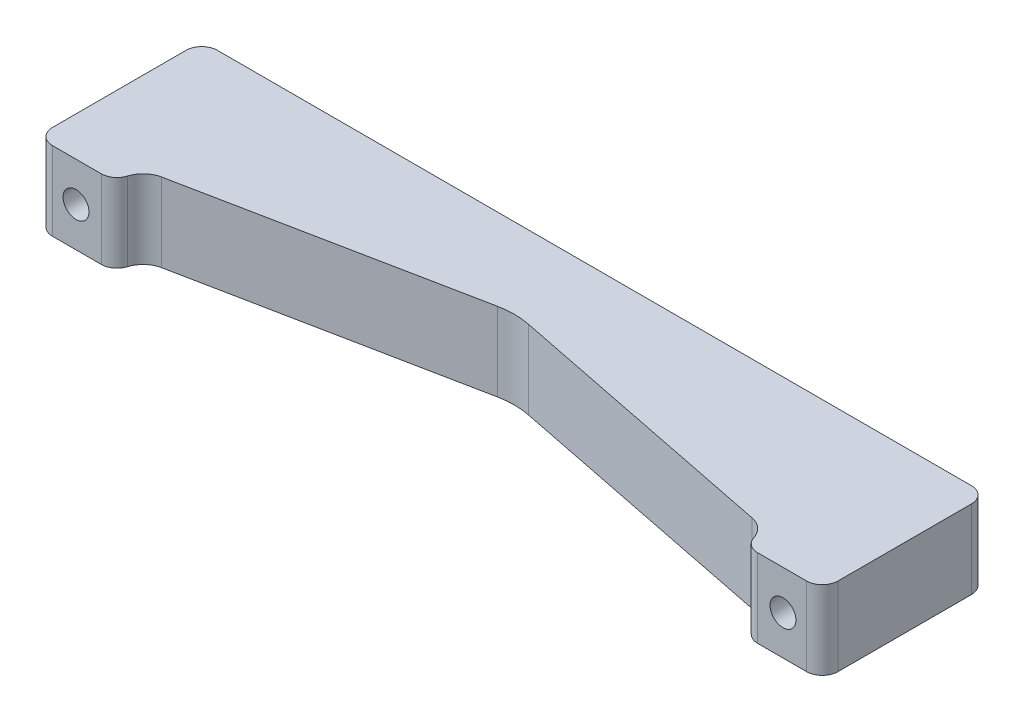
ISO-10303-21;
HEADER;
FILE_DESCRIPTION(('STEP AP214'),'2;1');
FILE_NAME('part.step','',(''),(''),'','','');
FILE_SCHEMA(('AUTOMOTIVE_DESIGN { 1 0 10303 214 1 1 1 1 }'));
ENDSEC;
DATA;
#1=APPLICATION_CONTEXT('core data for automotive mechanical design processes');
#2=APPLICATION_PROTOCOL_DEFINITION('international standard','automotive_design',2000,#1);
#3=PRODUCT_CONTEXT('',#1,'mechanical');
#4=PRODUCT('Part','Part','',(#3));
#5=PRODUCT_RELATED_PRODUCT_CATEGORY('part','',(#4));
#6=PRODUCT_DEFINITION_FORMATION('','',#4);
#7=PRODUCT_DEFINITION_CONTEXT('part definition',#1,'design');
#8=PRODUCT_DEFINITION('design','',#6,#7);
#9=PRODUCT_DEFINITION_SHAPE('','',#8);
#10=(LENGTH_UNIT() NAMED_UNIT(*) SI_UNIT(.MILLI.,.METRE.));
#11=(NAMED_UNIT(*) PLANE_ANGLE_UNIT() SI_UNIT($,.RADIAN.));
#12=(NAMED_UNIT(*) SI_UNIT($,.STERADIAN.) SOLID_ANGLE_UNIT());
#13=UNCERTAINTY_MEASURE_WITH_UNIT(LENGTH_MEASURE(1.E-05),#10,'distance_accuracy_value','');
#14=(GEOMETRIC_REPRESENTATION_CONTEXT(3) GLOBAL_UNCERTAINTY_ASSIGNED_CONTEXT((#13)) GLOBAL_UNIT_ASSIGNED_CONTEXT((#10,
#11,#12)) REPRESENTATION_CONTEXT('',''));
#15=CARTESIAN_POINT('',(0.,0.,0.));
#16=DIRECTION('',(0.,0.,1.));
#17=DIRECTION('',(1.,0.,0.));
#18=AXIS2_PLACEMENT_3D('',#15,#16,#17);
#19=CARTESIAN_POINT('',(0.,10.,-11.));
#20=DIRECTION('',(0.196116135138184,0.,-0.98058067569092));
#21=DIRECTION('',(-0.98058067569092,0.,-0.196116135138184));
#22=AXIS2_PLACEMENT_3D('',#19,#20,#21);
#23=PLANE('',#22);
#24=DIRECTION('',(0.98058067569092,0.,0.196116135138184));
#25=VECTOR('',#24,1.);
#26=CARTESIAN_POINT('',(0.,10.,-11.));
#27=LINE('',#26,#25);
#28=CARTESIAN_POINT('',(1.96116135138184,10.,-10.6077677297236));
#29=VERTEX_POINT('',#28);
#30=CARTESIAN_POINT('',(37.5883484054145,10.,-3.48233031891711));
#31=VERTEX_POINT('',#30);
#32=EDGE_CURVE('E267',#29,#31,#27,.T.);
#33=ORIENTED_EDGE('',*,*,#32,.F.);
#34=DIRECTION('',(0.,-1.,0.));
#35=VECTOR('',#34,1.);
#36=CARTESIAN_POINT('',(1.96116135138184,0.,-10.6077677297236));
#37=LINE('',#36,#35);
#38=CARTESIAN_POINT('',(1.96116135138184,0.,-10.6077677297236));
#39=VERTEX_POINT('',#38);
#40=EDGE_CURVE('E182',#29,#39,#37,.T.);
#41=ORIENTED_EDGE('',*,*,#40,.T.);
#42=DIRECTION('',(0.98058067569092,0.,0.196116135138184));
#43=VECTOR('',#42,1.);
#44=CARTESIAN_POINT('',(0.,0.,-11.));
#45=LINE('',#44,#43);
#46=CARTESIAN_POINT('',(37.5883484054145,0.,-3.48233031891711));
#47=VERTEX_POINT('',#46);
#48=EDGE_CURVE('E167',#39,#47,#45,.T.);
#49=ORIENTED_EDGE('',*,*,#48,.T.);
#50=DIRECTION('',(0.,-1.,0.));
#51=VECTOR('',#50,1.);
#52=CARTESIAN_POINT('',(37.5883484054145,10.,-3.48233031891711));
#53=LINE('',#52,#51);
#54=EDGE_CURVE('E179',#47,#31,#53,.F.);
#55=ORIENTED_EDGE('',*,*,#54,.T.);
#56=EDGE_LOOP('',(#33,#41,#49,#55));
#57=FACE_BOUND('',#56,.T.);
#58=ADVANCED_FACE('F48',(#57),#23,.F.);
#59=CARTESIAN_POINT('',(40.,10.,0.));
#60=DIRECTION('',(0.,0.,-1.));
#61=DIRECTION('',(-1.,0.,0.));
#62=AXIS2_PLACEMENT_3D('',#59,#60,#61);
#63=PLANE('',#62);
#64=CARTESIAN_POINT('',(45.,5.,0.));
#65=DIRECTION('',(0.,0.,1.));
#66=DIRECTION('',(1.,0.,0.));
#67=AXIS2_PLACEMENT_3D('',#64,#65,#66);
#68=CIRCLE('',#67,1.64999999999999);
#69=CARTESIAN_POINT('',(46.65,5.,0.));
#70=VERTEX_POINT('',#69);
#71=EDGE_CURVE('E294',#70,#70,#68,.T.);
#72=ORIENTED_EDGE('',*,*,#71,.F.);
#73=EDGE_LOOP('',(#72));
#74=FACE_BOUND('',#73,.T.);
#75=DIRECTION('',(1.,0.,0.));
#76=VECTOR('',#75,1.);
#77=CARTESIAN_POINT('',(40.,10.,0.));
#78=LINE('',#77,#76);
#79=CARTESIAN_POINT('',(41.7822711619165,10.,0.));
#80=VERTEX_POINT('',#79);
#81=CARTESIAN_POINT('',(48.,10.,0.));
#82=VERTEX_POINT('',#81);
#83=EDGE_CURVE('E288',#80,#82,#78,.T.);
#84=ORIENTED_EDGE('',*,*,#83,.F.);
#85=DIRECTION('',(0.,1.,0.));
#86=VECTOR('',#85,1.);
#87=CARTESIAN_POINT('',(41.7822711619165,10.,0.));
#88=LINE('',#87,#86);
#89=CARTESIAN_POINT('',(41.7822711619165,0.,0.));
#90=VERTEX_POINT('',#89);
#91=EDGE_CURVE('E214',#80,#90,#88,.F.);
#92=ORIENTED_EDGE('',*,*,#91,.T.);
#93=DIRECTION('',(1.,0.,0.));
#94=VECTOR('',#93,1.);
#95=CARTESIAN_POINT('',(40.,0.,0.));
#96=LINE('',#95,#94);
#97=CARTESIAN_POINT('',(48.,0.,0.));
#98=VERTEX_POINT('',#97);
#99=EDGE_CURVE('E183',#90,#98,#96,.T.);
#100=ORIENTED_EDGE('',*,*,#99,.T.);
#101=DIRECTION('',(0.,-1.,0.));
#102=VECTOR('',#101,1.);
#103=CARTESIAN_POINT('',(48.,10.,0.));
#104=LINE('',#103,#102);
#105=EDGE_CURVE('E212',#98,#82,#104,.F.);
#106=ORIENTED_EDGE('',*,*,#105,.T.);
#107=EDGE_LOOP('',(#84,#92,#100,#106));
#108=FACE_BOUND('',#107,.T.);
#109=ADVANCED_FACE('F322',(#74,#108),#63,.F.);
#110=CARTESIAN_POINT('',(50.,10.,0.));
#111=DIRECTION('',(-1.,0.,0.));
#112=DIRECTION('',(0.,0.,1.));
#113=AXIS2_PLACEMENT_3D('',#110,#111,#112);
#114=PLANE('',#113);
#115=DIRECTION('',(0.,0.,-1.));
#116=VECTOR('',#115,1.);
#117=CARTESIAN_POINT('',(50.,10.,0.));
#118=LINE('',#117,#116);
#119=CARTESIAN_POINT('',(50.,10.,-1.99999999999993));
#120=VERTEX_POINT('',#119);
#121=CARTESIAN_POINT('',(50.,10.,-19.));
#122=VERTEX_POINT('',#121);
#123=EDGE_CURVE('E285',#120,#122,#118,.T.);
#124=ORIENTED_EDGE('',*,*,#123,.F.);
#125=DIRECTION('',(0.,-1.,0.));
#126=VECTOR('',#125,1.);
#127=CARTESIAN_POINT('',(50.,10.,-1.99999999999993));
#128=LINE('',#127,#126);
#129=CARTESIAN_POINT('',(50.,0.,-1.99999999999993));
#130=VERTEX_POINT('',#129);
#131=EDGE_CURVE('E243',#120,#130,#128,.T.);
#132=ORIENTED_EDGE('',*,*,#131,.T.);
#133=DIRECTION('',(0.,0.,-1.));
#134=VECTOR('',#133,1.);
#135=CARTESIAN_POINT('',(50.,0.,0.));
#136=LINE('',#135,#134);
#137=CARTESIAN_POINT('',(50.,0.,-19.));
#138=VERTEX_POINT('',#137);
#139=EDGE_CURVE('E273',#130,#138,#136,.T.);
#140=ORIENTED_EDGE('',*,*,#139,.T.);
#141=DIRECTION('',(0.,-1.,0.));
#142=VECTOR('',#141,1.);
#143=CARTESIAN_POINT('',(50.,10.,-19.));
#144=LINE('',#143,#142);
#145=EDGE_CURVE('E241',#138,#122,#144,.F.);
#146=ORIENTED_EDGE('',*,*,#145,.T.);
#147=EDGE_LOOP('',(#124,#132,#140,#146));
#148=FACE_BOUND('',#147,.T.);
#149=ADVANCED_FACE('F328',(#148),#114,.F.);
#150=CARTESIAN_POINT('',(50.,10.,-21.));
#151=DIRECTION('',(0.,0.,1.));
#152=DIRECTION('',(1.,0.,0.));
#153=AXIS2_PLACEMENT_3D('',#150,#151,#152);
#154=PLANE('',#153);
#155=CARTESIAN_POINT('',(-45.,5.,-21.));
#156=DIRECTION('',(0.,0.,1.));
#157=DIRECTION('',(1.,0.,0.));
#158=AXIS2_PLACEMENT_3D('',#155,#156,#157);
#159=CIRCLE('',#158,1.65);
#160=CARTESIAN_POINT('',(-43.35,5.,-21.));
#161=VERTEX_POINT('',#160);
#162=EDGE_CURVE('E297',#161,#161,#159,.T.);
#163=ORIENTED_EDGE('',*,*,#162,.T.);
#164=EDGE_LOOP('',(#163));
#165=FACE_BOUND('',#164,.T.);
#166=CARTESIAN_POINT('',(45.,5.,-21.));
#167=DIRECTION('',(0.,0.,1.));
#168=DIRECTION('',(1.,0.,0.));
#169=AXIS2_PLACEMENT_3D('',#166,#167,#168);
#170=CIRCLE('',#169,1.65);
#171=CARTESIAN_POINT('',(46.65,5.,-21.));
#172=VERTEX_POINT('',#171);
#173=EDGE_CURVE('E184',#172,#172,#170,.T.);
#174=ORIENTED_EDGE('',*,*,#173,.T.);
#175=EDGE_LOOP('',(#174));
#176=FACE_BOUND('',#175,.T.);
#177=DIRECTION('',(-1.,0.,0.));
#178=VECTOR('',#177,1.);
#179=CARTESIAN_POINT('',(50.,10.,-21.));
#180=LINE('',#179,#178);
#181=CARTESIAN_POINT('',(48.,10.,-21.));
#182=VERTEX_POINT('',#181);
#183=CARTESIAN_POINT('',(-48.,10.,-21.));
#184=VERTEX_POINT('',#183);
#185=EDGE_CURVE('E282',#182,#184,#180,.T.);
#186=ORIENTED_EDGE('',*,*,#185,.F.);
#187=DIRECTION('',(0.,-1.,0.));
#188=VECTOR('',#187,1.);
#189=CARTESIAN_POINT('',(48.,10.,-21.));
#190=LINE('',#189,#188);
#191=CARTESIAN_POINT('',(48.,0.,-21.));
#192=VERTEX_POINT('',#191);
#193=EDGE_CURVE('E248',#182,#192,#190,.T.);
#194=ORIENTED_EDGE('',*,*,#193,.T.);
#195=DIRECTION('',(-1.,0.,0.));
#196=VECTOR('',#195,1.);
#197=CARTESIAN_POINT('',(50.,0.,-21.));
#198=LINE('',#197,#196);
#199=CARTESIAN_POINT('',(-48.,0.,-21.));
#200=VERTEX_POINT('',#199);
#201=EDGE_CURVE('E268',#192,#200,#198,.T.);
#202=ORIENTED_EDGE('',*,*,#201,.T.);
#203=DIRECTION('',(0.,-1.,0.));
#204=VECTOR('',#203,1.);
#205=CARTESIAN_POINT('',(-48.,10.,-21.));
#206=LINE('',#205,#204);
#207=EDGE_CURVE('E246',#200,#184,#206,.F.);
#208=ORIENTED_EDGE('',*,*,#207,.T.);
#209=EDGE_LOOP('',(#186,#194,#202,#208));
#210=FACE_BOUND('',#209,.T.);
#211=ADVANCED_FACE('F318',(#165,#176,#210),#154,.F.);
#212=CARTESIAN_POINT('',(-50.,10.,0.));
#213=DIRECTION('',(1.,0.,0.));
#214=DIRECTION('',(0.,0.,-1.));
#215=AXIS2_PLACEMENT_3D('',#212,#213,#214);
#216=PLANE('',#215);
#217=DIRECTION('',(0.,0.,1.));
#218=VECTOR('',#217,1.);
#219=CARTESIAN_POINT('',(-50.,10.,0.));
#220=LINE('',#219,#218);
#221=CARTESIAN_POINT('',(-50.,10.,-19.));
#222=VERTEX_POINT('',#221);
#223=CARTESIAN_POINT('',(-50.,10.,-2.));
#224=VERTEX_POINT('',#223);
#225=EDGE_CURVE('E279',#222,#224,#220,.T.);
#226=ORIENTED_EDGE('',*,*,#225,.F.);
#227=DIRECTION('',(0.,-1.,0.));
#228=VECTOR('',#227,1.);
#229=CARTESIAN_POINT('',(-50.,10.,-19.));
#230=LINE('',#229,#228);
#231=CARTESIAN_POINT('',(-50.,0.,-19.));
#232=VERTEX_POINT('',#231);
#233=EDGE_CURVE('E253',#222,#232,#230,.T.);
#234=ORIENTED_EDGE('',*,*,#233,.T.);
#235=DIRECTION('',(0.,0.,1.));
#236=VECTOR('',#235,1.);
#237=CARTESIAN_POINT('',(-50.,0.,0.));
#238=LINE('',#237,#236);
#239=CARTESIAN_POINT('',(-50.,0.,-2.));
#240=VERTEX_POINT('',#239);
#241=EDGE_CURVE('E265',#232,#240,#238,.T.);
#242=ORIENTED_EDGE('',*,*,#241,.T.);
#243=DIRECTION('',(0.,-1.,0.));
#244=VECTOR('',#243,1.);
#245=CARTESIAN_POINT('',(-50.,10.,-2.));
#246=LINE('',#245,#244);
#247=EDGE_CURVE('E251',#240,#224,#246,.F.);
#248=ORIENTED_EDGE('',*,*,#247,.T.);
#249=EDGE_LOOP('',(#226,#234,#242,#248));
#250=FACE_BOUND('',#249,.T.);
#251=ADVANCED_FACE('F308',(#250),#216,.F.);
#252=CARTESIAN_POINT('',(-40.,10.,0.));
#253=DIRECTION('',(0.,0.,-1.));
#254=DIRECTION('',(-1.,0.,0.));
#255=AXIS2_PLACEMENT_3D('',#252,#253,#254);
#256=PLANE('',#255);
#257=CARTESIAN_POINT('',(-45.,5.,0.));
#258=DIRECTION('',(0.,0.,1.));
#259=DIRECTION('',(1.,0.,0.));
#260=AXIS2_PLACEMENT_3D('',#257,#258,#259);
#261=CIRCLE('',#260,1.64999999999998);
#262=CARTESIAN_POINT('',(-43.35,5.,0.));
#263=VERTEX_POINT('',#262);
#264=EDGE_CURVE('E300',#263,#263,#261,.T.);
#265=ORIENTED_EDGE('',*,*,#264,.F.);
#266=EDGE_LOOP('',(#265));
#267=FACE_BOUND('',#266,.T.);
#268=DIRECTION('',(1.,0.,0.));
#269=VECTOR('',#268,1.);
#270=CARTESIAN_POINT('',(-40.,10.,0.));
#271=LINE('',#270,#269);
#272=CARTESIAN_POINT('',(-48.,10.,0.));
#273=VERTEX_POINT('',#272);
#274=CARTESIAN_POINT('',(-41.7822711619165,10.,0.));
#275=VERTEX_POINT('',#274);
#276=EDGE_CURVE('E193',#273,#275,#271,.T.);
#277=ORIENTED_EDGE('',*,*,#276,.F.);
#278=DIRECTION('',(0.,-1.,0.));
#279=VECTOR('',#278,1.);
#280=CARTESIAN_POINT('',(-48.,10.,0.));
#281=LINE('',#280,#279);
#282=CARTESIAN_POINT('',(-48.,0.,0.));
#283=VERTEX_POINT('',#282);
#284=EDGE_CURVE('E56',#273,#283,#281,.T.);
#285=ORIENTED_EDGE('',*,*,#284,.T.);
#286=DIRECTION('',(1.,0.,0.));
#287=VECTOR('',#286,1.);
#288=CARTESIAN_POINT('',(-40.,0.,0.));
#289=LINE('',#288,#287);
#290=CARTESIAN_POINT('',(-41.7822711619165,0.,0.));
#291=VERTEX_POINT('',#290);
#292=EDGE_CURVE('E260',#283,#291,#289,.T.);
#293=ORIENTED_EDGE('',*,*,#292,.T.);
#294=DIRECTION('',(0.,1.,0.));
#295=VECTOR('',#294,1.);
#296=CARTESIAN_POINT('',(-41.7822711619165,10.,0.));
#297=LINE('',#296,#295);
#298=EDGE_CURVE('E71',#291,#275,#297,.T.);
#299=ORIENTED_EDGE('',*,*,#298,.T.);
#300=EDGE_LOOP('',(#277,#285,#293,#299));
#301=FACE_BOUND('',#300,.T.);
#302=ADVANCED_FACE('F259',(#267,#301),#256,.F.);
#303=CARTESIAN_POINT('',(0.,10.,-11.));
#304=DIRECTION('',(-0.196116135138184,0.,-0.98058067569092));
#305=DIRECTION('',(-0.98058067569092,0.,0.196116135138184));
#306=AXIS2_PLACEMENT_3D('',#303,#304,#305);
#307=PLANE('',#306);
#308=DIRECTION('',(0.98058067569092,0.,-0.196116135138184));
#309=VECTOR('',#308,1.);
#310=CARTESIAN_POINT('',(0.,0.,-11.));
#311=LINE('',#310,#309);
#312=CARTESIAN_POINT('',(-37.5883484054145,0.,-3.4823303189171));
#313=VERTEX_POINT('',#312);
#314=CARTESIAN_POINT('',(-1.96116135138184,0.,-10.6077677297236));
#315=VERTEX_POINT('',#314);
#316=EDGE_CURVE('E196',#313,#315,#311,.T.);
#317=ORIENTED_EDGE('',*,*,#316,.T.);
#318=DIRECTION('',(0.,-1.,0.));
#319=VECTOR('',#318,1.);
#320=CARTESIAN_POINT('',(-1.96116135138184,10.,-10.6077677297236));
#321=LINE('',#320,#319);
#322=CARTESIAN_POINT('',(-1.96116135138184,10.,-10.6077677297236));
#323=VERTEX_POINT('',#322);
#324=EDGE_CURVE('E206',#315,#323,#321,.F.);
#325=ORIENTED_EDGE('',*,*,#324,.T.);
#326=DIRECTION('',(0.98058067569092,0.,-0.196116135138184));
#327=VECTOR('',#326,1.);
#328=CARTESIAN_POINT('',(0.,10.,-11.));
#329=LINE('',#328,#327);
#330=CARTESIAN_POINT('',(-37.5883484054145,10.,-3.4823303189171));
#331=VERTEX_POINT('',#330);
#332=EDGE_CURVE('E188',#331,#323,#329,.T.);
#333=ORIENTED_EDGE('',*,*,#332,.F.);
#334=DIRECTION('',(0.,-1.,0.));
#335=VECTOR('',#334,1.);
#336=CARTESIAN_POINT('',(-37.5883484054146,0.,-3.4823303189171));
#337=LINE('',#336,#335);
#338=EDGE_CURVE('E173',#331,#313,#337,.T.);
#339=ORIENTED_EDGE('',*,*,#338,.T.);
#340=EDGE_LOOP('',(#317,#325,#333,#339));
#341=FACE_BOUND('',#340,.T.);
#342=ADVANCED_FACE('F307',(#341),#307,.F.);
#343=CARTESIAN_POINT('',(0.,10.,0.));
#344=DIRECTION('',(0.,-1.,0.));
#345=DIRECTION('',(0.,0.,-1.));
#346=AXIS2_PLACEMENT_3D('',#343,#344,#345);
#347=PLANE('',#346);
#348=CARTESIAN_POINT('',(37.,10.,-0.540588291844344));
#349=DIRECTION('',(0.,-1.,0.));
#350=DIRECTION('',(0.,0.,-1.));
#351=AXIS2_PLACEMENT_3D('',#348,#349,#350);
#352=CIRCLE('',#351,3.);
#353=CARTESIAN_POINT('',(39.8693626971499,10.,-1.41623531673771));
#354=VERTEX_POINT('',#353);
#355=EDGE_CURVE('E172',#31,#354,#352,.T.);
#356=ORIENTED_EDGE('',*,*,#355,.T.);
#357=CARTESIAN_POINT('',(41.7822711619165,10.,-1.99999999999995));
#358=DIRECTION('',(0.,-1.,0.));
#359=DIRECTION('',(0.,0.,-1.));
#360=AXIS2_PLACEMENT_3D('',#357,#358,#359);
#361=CIRCLE('',#360,2.);
#362=EDGE_CURVE('E239',#354,#80,#361,.F.);
#363=ORIENTED_EDGE('',*,*,#362,.T.);
#364=ORIENTED_EDGE('',*,*,#83,.T.);
#365=CARTESIAN_POINT('',(48.,10.,-1.99999999999994));
#366=DIRECTION('',(0.,-1.,0.));
#367=DIRECTION('',(0.,0.,-1.));
#368=AXIS2_PLACEMENT_3D('',#365,#366,#367);
#369=CIRCLE('',#368,2.);
#370=EDGE_CURVE('E237',#82,#120,#369,.F.);
#371=ORIENTED_EDGE('',*,*,#370,.T.);
#372=ORIENTED_EDGE('',*,*,#123,.T.);
#373=CARTESIAN_POINT('',(48.,10.,-19.));
#374=DIRECTION('',(0.,-1.,0.));
#375=DIRECTION('',(0.,0.,-1.));
#376=AXIS2_PLACEMENT_3D('',#373,#374,#375);
#377=CIRCLE('',#376,2.);
#378=EDGE_CURVE('E235',#122,#182,#377,.F.);
#379=ORIENTED_EDGE('',*,*,#378,.T.);
#380=ORIENTED_EDGE('',*,*,#185,.T.);
#381=CARTESIAN_POINT('',(-48.,10.,-19.));
#382=DIRECTION('',(0.,-1.,0.));
#383=DIRECTION('',(0.,0.,-1.));
#384=AXIS2_PLACEMENT_3D('',#381,#382,#383);
#385=CIRCLE('',#384,2.);
#386=EDGE_CURVE('E233',#184,#222,#385,.F.);
#387=ORIENTED_EDGE('',*,*,#386,.T.);
#388=ORIENTED_EDGE('',*,*,#225,.T.);
#389=CARTESIAN_POINT('',(-48.,10.,-2.));
#390=DIRECTION('',(0.,-1.,0.));
#391=DIRECTION('',(0.,0.,-1.));
#392=AXIS2_PLACEMENT_3D('',#389,#390,#391);
#393=CIRCLE('',#392,2.);
#394=EDGE_CURVE('E231',#224,#273,#393,.F.);
#395=ORIENTED_EDGE('',*,*,#394,.T.);
#396=ORIENTED_EDGE('',*,*,#276,.T.);
#397=CARTESIAN_POINT('',(-41.7822711619165,10.,-2.));
#398=DIRECTION('',(0.,-1.,0.));
#399=DIRECTION('',(0.,0.,-1.));
#400=AXIS2_PLACEMENT_3D('',#397,#398,#399);
#401=CIRCLE('',#400,2.);
#402=CARTESIAN_POINT('',(-39.8693626971499,10.,-1.41623531673774));
#403=VERTEX_POINT('',#402);
#404=EDGE_CURVE('E63',#275,#403,#401,.F.);
#405=ORIENTED_EDGE('',*,*,#404,.T.);
#406=CARTESIAN_POINT('',(-37.,10.,-0.540588291844338));
#407=DIRECTION('',(0.,-1.,0.));
#408=DIRECTION('',(0.,0.,-1.));
#409=AXIS2_PLACEMENT_3D('',#406,#407,#408);
#410=CIRCLE('',#409,3.);
#411=EDGE_CURVE('E203',#403,#331,#410,.T.);
#412=ORIENTED_EDGE('',*,*,#411,.T.);
#413=ORIENTED_EDGE('',*,*,#332,.T.);
#414=CARTESIAN_POINT('',(0.,10.,-0.801960972814435));
#415=DIRECTION('',(0.,-1.,0.));
#416=DIRECTION('',(0.,0.,-1.));
#417=AXIS2_PLACEMENT_3D('',#414,#415,#416);
#418=CIRCLE('',#417,10.);
#419=EDGE_CURVE('E210',#323,#29,#418,.T.);
#420=ORIENTED_EDGE('',*,*,#419,.T.);
#421=ORIENTED_EDGE('',*,*,#32,.T.);
#422=EDGE_LOOP('',(#356,#363,#364,#371,#372,#379,#380,#387,#388,#395,#396,#405,#412,#413,#420,#421));
#423=FACE_BOUND('',#422,.T.);
#424=ADVANCED_FACE('F315',(#423),#347,.F.);
#425=CARTESIAN_POINT('',(0.,0.,0.));
#426=DIRECTION('',(0.,-1.,0.));
#427=DIRECTION('',(0.,0.,-1.));
#428=AXIS2_PLACEMENT_3D('',#425,#426,#427);
#429=PLANE('',#428);
#430=ORIENTED_EDGE('',*,*,#99,.F.);
#431=CARTESIAN_POINT('',(41.7822711619165,0.,-1.99999999999995));
#432=DIRECTION('',(0.,-1.,0.));
#433=DIRECTION('',(0.,0.,-1.));
#434=AXIS2_PLACEMENT_3D('',#431,#432,#433);
#435=CIRCLE('',#434,2.);
#436=CARTESIAN_POINT('',(39.8693626971499,0.,-1.41623531673771));
#437=VERTEX_POINT('',#436);
#438=EDGE_CURVE('E168',#90,#437,#435,.T.);
#439=ORIENTED_EDGE('',*,*,#438,.T.);
#440=CARTESIAN_POINT('',(37.,0.,-0.540588291844344));
#441=DIRECTION('',(0.,-1.,0.));
#442=DIRECTION('',(0.,0.,-1.));
#443=AXIS2_PLACEMENT_3D('',#440,#441,#442);
#444=CIRCLE('',#443,3.);
#445=EDGE_CURVE('E163',#437,#47,#444,.F.);
#446=ORIENTED_EDGE('',*,*,#445,.T.);
#447=ORIENTED_EDGE('',*,*,#48,.F.);
#448=CARTESIAN_POINT('',(0.,0.,-0.801960972814435));
#449=DIRECTION('',(0.,-1.,0.));
#450=DIRECTION('',(0.,0.,-1.));
#451=AXIS2_PLACEMENT_3D('',#448,#449,#450);
#452=CIRCLE('',#451,10.);
#453=EDGE_CURVE('E208',#39,#315,#452,.F.);
#454=ORIENTED_EDGE('',*,*,#453,.T.);
#455=ORIENTED_EDGE('',*,*,#316,.F.);
#456=CARTESIAN_POINT('',(-37.,0.,-0.540588291844338));
#457=DIRECTION('',(0.,-1.,0.));
#458=DIRECTION('',(0.,0.,-1.));
#459=AXIS2_PLACEMENT_3D('',#456,#457,#458);
#460=CIRCLE('',#459,3.);
#461=CARTESIAN_POINT('',(-39.8693626971499,0.,-1.41623531673774));
#462=VERTEX_POINT('',#461);
#463=EDGE_CURVE('E200',#313,#462,#460,.F.);
#464=ORIENTED_EDGE('',*,*,#463,.T.);
#465=CARTESIAN_POINT('',(-41.7822711619165,0.,-2.));
#466=DIRECTION('',(0.,-1.,0.));
#467=DIRECTION('',(0.,0.,-1.));
#468=AXIS2_PLACEMENT_3D('',#465,#466,#467);
#469=CIRCLE('',#468,2.);
#470=EDGE_CURVE('E217',#462,#291,#469,.T.);
#471=ORIENTED_EDGE('',*,*,#470,.T.);
#472=ORIENTED_EDGE('',*,*,#292,.F.);
#473=CARTESIAN_POINT('',(-48.,0.,-2.));
#474=DIRECTION('',(0.,-1.,0.));
#475=DIRECTION('',(0.,0.,-1.));
#476=AXIS2_PLACEMENT_3D('',#473,#474,#475);
#477=CIRCLE('',#476,2.);
#478=EDGE_CURVE('E219',#283,#240,#477,.T.);
#479=ORIENTED_EDGE('',*,*,#478,.T.);
#480=ORIENTED_EDGE('',*,*,#241,.F.);
#481=CARTESIAN_POINT('',(-48.,0.,-19.));
#482=DIRECTION('',(0.,-1.,0.));
#483=DIRECTION('',(0.,0.,-1.));
#484=AXIS2_PLACEMENT_3D('',#481,#482,#483);
#485=CIRCLE('',#484,2.);
#486=EDGE_CURVE('E221',#232,#200,#485,.T.);
#487=ORIENTED_EDGE('',*,*,#486,.T.);
#488=ORIENTED_EDGE('',*,*,#201,.F.);
#489=CARTESIAN_POINT('',(48.,0.,-19.));
#490=DIRECTION('',(0.,-1.,0.));
#491=DIRECTION('',(0.,0.,-1.));
#492=AXIS2_PLACEMENT_3D('',#489,#490,#491);
#493=CIRCLE('',#492,2.);
#494=EDGE_CURVE('E223',#192,#138,#493,.T.);
#495=ORIENTED_EDGE('',*,*,#494,.T.);
#496=ORIENTED_EDGE('',*,*,#139,.F.);
#497=CARTESIAN_POINT('',(48.,0.,-1.99999999999994));
#498=DIRECTION('',(0.,-1.,0.));
#499=DIRECTION('',(0.,0.,-1.));
#500=AXIS2_PLACEMENT_3D('',#497,#498,#499);
#501=CIRCLE('',#500,2.);
#502=EDGE_CURVE('E225',#130,#98,#501,.T.);
#503=ORIENTED_EDGE('',*,*,#502,.T.);
#504=EDGE_LOOP('',(#430,#439,#446,#447,#454,#455,#464,#471,#472,#479,#480,#487,#488,#495,#496,#503));
#505=FACE_BOUND('',#504,.T.);
#506=ADVANCED_FACE('F166',(#505),#429,.T.);
#507=CARTESIAN_POINT('',(37.,10.,-0.540588291844344));
#508=DIRECTION('',(0.,1.,0.));
#509=DIRECTION('',(0.,0.,1.));
#510=AXIS2_PLACEMENT_3D('',#507,#508,#509);
#511=CYLINDRICAL_SURFACE('',#510,3.);
#512=ORIENTED_EDGE('',*,*,#445,.F.);
#513=DIRECTION('',(0.,1.,0.));
#514=VECTOR('',#513,1.);
#515=CARTESIAN_POINT('',(39.8693626971499,10.,-1.41623531673771));
#516=LINE('',#515,#514);
#517=EDGE_CURVE('E228',#437,#354,#516,.T.);
#518=ORIENTED_EDGE('',*,*,#517,.T.);
#519=ORIENTED_EDGE('',*,*,#355,.F.);
#520=ORIENTED_EDGE('',*,*,#54,.F.);
#521=EDGE_LOOP('',(#512,#518,#519,#520));
#522=FACE_BOUND('',#521,.T.);
#523=ADVANCED_FACE('F186',(#522),#511,.F.);
#524=CARTESIAN_POINT('',(-37.,10.,-0.540588291844338));
#525=DIRECTION('',(0.,1.,0.));
#526=DIRECTION('',(0.,0.,1.));
#527=AXIS2_PLACEMENT_3D('',#524,#525,#526);
#528=CYLINDRICAL_SURFACE('',#527,3.);
#529=ORIENTED_EDGE('',*,*,#411,.F.);
#530=DIRECTION('',(0.,1.,0.));
#531=VECTOR('',#530,1.);
#532=CARTESIAN_POINT('',(-39.8693626971499,10.,-1.41623531673774));
#533=LINE('',#532,#531);
#534=EDGE_CURVE('E13',#403,#462,#533,.F.);
#535=ORIENTED_EDGE('',*,*,#534,.T.);
#536=ORIENTED_EDGE('',*,*,#463,.F.);
#537=ORIENTED_EDGE('',*,*,#338,.F.);
#538=EDGE_LOOP('',(#529,#535,#536,#537));
#539=FACE_BOUND('',#538,.T.);
#540=ADVANCED_FACE('F335',(#539),#528,.F.);
#541=CARTESIAN_POINT('',(0.,10.,-0.801960972814435));
#542=DIRECTION('',(0.,1.,0.));
#543=DIRECTION('',(0.,0.,1.));
#544=AXIS2_PLACEMENT_3D('',#541,#542,#543);
#545=CYLINDRICAL_SURFACE('',#544,10.);
#546=ORIENTED_EDGE('',*,*,#419,.F.);
#547=ORIENTED_EDGE('',*,*,#324,.F.);
#548=ORIENTED_EDGE('',*,*,#453,.F.);
#549=ORIENTED_EDGE('',*,*,#40,.F.);
#550=EDGE_LOOP('',(#546,#547,#548,#549));
#551=FACE_BOUND('',#550,.T.);
#552=ADVANCED_FACE('F338',(#551),#545,.F.);
#553=CARTESIAN_POINT('',(45.,5.,0.));
#554=DIRECTION('',(0.,0.,1.));
#555=DIRECTION('',(1.,0.,0.));
#556=AXIS2_PLACEMENT_3D('',#553,#554,#555);
#557=CYLINDRICAL_SURFACE('',#556,1.65);
#558=ORIENTED_EDGE('',*,*,#173,.F.);
#559=EDGE_LOOP('',(#558));
#560=FACE_BOUND('',#559,.T.);
#561=ORIENTED_EDGE('',*,*,#71,.T.);
#562=EDGE_LOOP('',(#561));
#563=FACE_BOUND('',#562,.T.);
#564=ADVANCED_FACE('F342',(#560,#563),#557,.F.);
#565=CARTESIAN_POINT('',(-45.,5.,0.));
#566=DIRECTION('',(0.,0.,1.));
#567=DIRECTION('',(1.,0.,0.));
#568=AXIS2_PLACEMENT_3D('',#565,#566,#567);
#569=CYLINDRICAL_SURFACE('',#568,1.64999999999999);
#570=ORIENTED_EDGE('',*,*,#162,.F.);
#571=EDGE_LOOP('',(#570));
#572=FACE_BOUND('',#571,.T.);
#573=ORIENTED_EDGE('',*,*,#264,.T.);
#574=EDGE_LOOP('',(#573));
#575=FACE_BOUND('',#574,.T.);
#576=ADVANCED_FACE('F304',(#572,#575),#569,.F.);
#577=CARTESIAN_POINT('',(41.7822711619165,10.,-1.99999999999995));
#578=DIRECTION('',(0.,1.,0.));
#579=DIRECTION('',(0.,0.,1.));
#580=AXIS2_PLACEMENT_3D('',#577,#578,#579);
#581=CYLINDRICAL_SURFACE('',#580,2.);
#582=ORIENTED_EDGE('',*,*,#362,.F.);
#583=ORIENTED_EDGE('',*,*,#517,.F.);
#584=ORIENTED_EDGE('',*,*,#438,.F.);
#585=ORIENTED_EDGE('',*,*,#91,.F.);
#586=EDGE_LOOP('',(#582,#583,#584,#585));
#587=FACE_BOUND('',#586,.T.);
#588=ADVANCED_FACE('F344',(#587),#581,.T.);
#589=CARTESIAN_POINT('',(48.,10.,-1.99999999999994));
#590=DIRECTION('',(0.,-1.,0.));
#591=DIRECTION('',(0.,0.,-1.));
#592=AXIS2_PLACEMENT_3D('',#589,#590,#591);
#593=CYLINDRICAL_SURFACE('',#592,2.);
#594=ORIENTED_EDGE('',*,*,#370,.F.);
#595=ORIENTED_EDGE('',*,*,#105,.F.);
#596=ORIENTED_EDGE('',*,*,#502,.F.);
#597=ORIENTED_EDGE('',*,*,#131,.F.);
#598=EDGE_LOOP('',(#594,#595,#596,#597));
#599=FACE_BOUND('',#598,.T.);
#600=ADVANCED_FACE('F347',(#599),#593,.T.);
#601=CARTESIAN_POINT('',(48.,10.,-19.));
#602=DIRECTION('',(0.,-1.,0.));
#603=DIRECTION('',(0.,0.,-1.));
#604=AXIS2_PLACEMENT_3D('',#601,#602,#603);
#605=CYLINDRICAL_SURFACE('',#604,2.);
#606=ORIENTED_EDGE('',*,*,#378,.F.);
#607=ORIENTED_EDGE('',*,*,#145,.F.);
#608=ORIENTED_EDGE('',*,*,#494,.F.);
#609=ORIENTED_EDGE('',*,*,#193,.F.);
#610=EDGE_LOOP('',(#606,#607,#608,#609));
#611=FACE_BOUND('',#610,.T.);
#612=ADVANCED_FACE('F351',(#611),#605,.T.);
#613=CARTESIAN_POINT('',(-48.,10.,-19.));
#614=DIRECTION('',(0.,-1.,0.));
#615=DIRECTION('',(0.,0.,-1.));
#616=AXIS2_PLACEMENT_3D('',#613,#614,#615);
#617=CYLINDRICAL_SURFACE('',#616,2.);
#618=ORIENTED_EDGE('',*,*,#386,.F.);
#619=ORIENTED_EDGE('',*,*,#207,.F.);
#620=ORIENTED_EDGE('',*,*,#486,.F.);
#621=ORIENTED_EDGE('',*,*,#233,.F.);
#622=EDGE_LOOP('',(#618,#619,#620,#621));
#623=FACE_BOUND('',#622,.T.);
#624=ADVANCED_FACE('F355',(#623),#617,.T.);
#625=CARTESIAN_POINT('',(-48.,10.,-2.));
#626=DIRECTION('',(0.,-1.,0.));
#627=DIRECTION('',(0.,0.,-1.));
#628=AXIS2_PLACEMENT_3D('',#625,#626,#627);
#629=CYLINDRICAL_SURFACE('',#628,2.);
#630=ORIENTED_EDGE('',*,*,#394,.F.);
#631=ORIENTED_EDGE('',*,*,#247,.F.);
#632=ORIENTED_EDGE('',*,*,#478,.F.);
#633=ORIENTED_EDGE('',*,*,#284,.F.);
#634=EDGE_LOOP('',(#630,#631,#632,#633));
#635=FACE_BOUND('',#634,.T.);
#636=ADVANCED_FACE('F358',(#635),#629,.T.);
#637=CARTESIAN_POINT('',(-41.7822711619165,10.,-2.));
#638=DIRECTION('',(0.,1.,0.));
#639=DIRECTION('',(0.,0.,1.));
#640=AXIS2_PLACEMENT_3D('',#637,#638,#639);
#641=CYLINDRICAL_SURFACE('',#640,2.);
#642=ORIENTED_EDGE('',*,*,#404,.F.);
#643=ORIENTED_EDGE('',*,*,#298,.F.);
#644=ORIENTED_EDGE('',*,*,#470,.F.);
#645=ORIENTED_EDGE('',*,*,#534,.F.);
#646=EDGE_LOOP('',(#642,#643,#644,#645));
#647=FACE_BOUND('',#646,.T.);
#648=ADVANCED_FACE('F50',(#647),#641,.T.);
#649=CLOSED_SHELL('',(#58,#109,#149,#211,#251,#302,#342,#424,#506,#523,#540,#552,#564,#576,#588,
#600,#612,#624,#636,#648));
#650=MANIFOLD_SOLID_BREP('B2',#649);
#651=ADVANCED_BREP_SHAPE_REPRESENTATION('',(#18,#650),#14);
#652=SHAPE_DEFINITION_REPRESENTATION(#9,#651);
ENDSEC;
END-ISO-10303-21;
